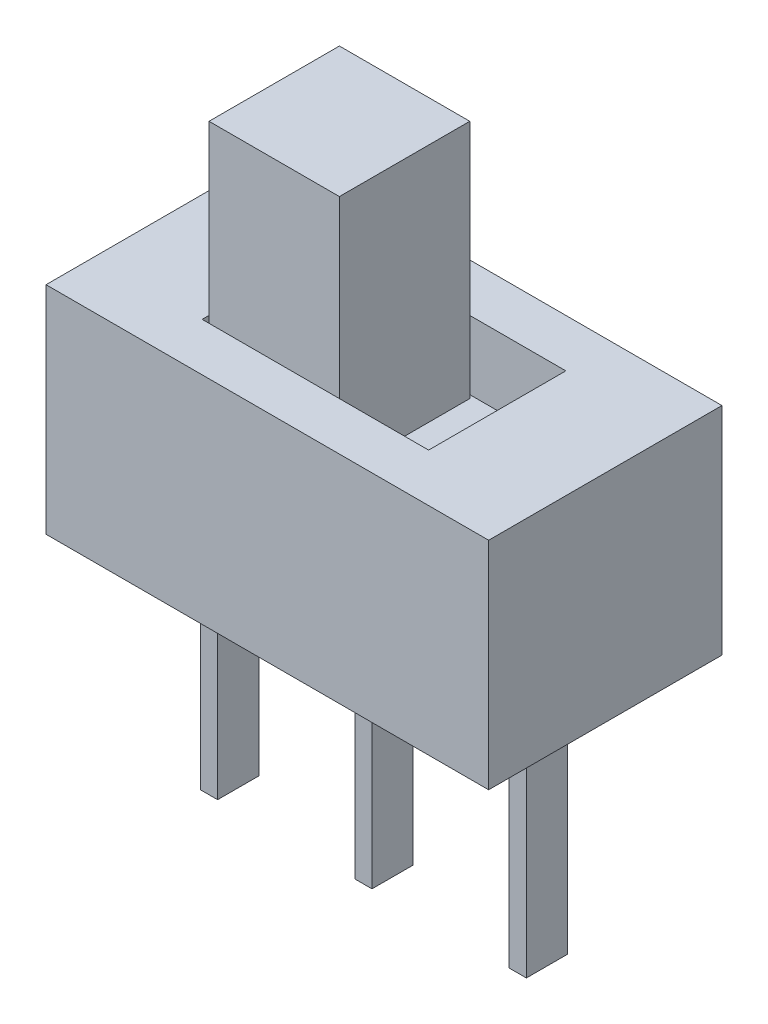
ISO-10303-21;
HEADER;
FILE_DESCRIPTION(('STEP AP214'),'2;1');
FILE_NAME('part.step','',(''),(''),'','','');
FILE_SCHEMA(('AUTOMOTIVE_DESIGN { 1 0 10303 214 1 1 1 1 }'));
ENDSEC;
DATA;
#1=APPLICATION_CONTEXT('core data for automotive mechanical design processes');
#2=APPLICATION_PROTOCOL_DEFINITION('international standard','automotive_design',2000,#1);
#3=PRODUCT_CONTEXT('',#1,'mechanical');
#4=PRODUCT('Part','Part','',(#3));
#5=PRODUCT_RELATED_PRODUCT_CATEGORY('part','',(#4));
#6=PRODUCT_DEFINITION_FORMATION('','',#4);
#7=PRODUCT_DEFINITION_CONTEXT('part definition',#1,'design');
#8=PRODUCT_DEFINITION('design','',#6,#7);
#9=PRODUCT_DEFINITION_SHAPE('','',#8);
#10=(LENGTH_UNIT() NAMED_UNIT(*) SI_UNIT(.MILLI.,.METRE.));
#11=(NAMED_UNIT(*) PLANE_ANGLE_UNIT() SI_UNIT($,.RADIAN.));
#12=(NAMED_UNIT(*) SI_UNIT($,.STERADIAN.) SOLID_ANGLE_UNIT());
#13=UNCERTAINTY_MEASURE_WITH_UNIT(LENGTH_MEASURE(1.E-05),#10,'distance_accuracy_value','');
#14=(GEOMETRIC_REPRESENTATION_CONTEXT(3) GLOBAL_UNCERTAINTY_ASSIGNED_CONTEXT((#13)) GLOBAL_UNIT_ASSIGNED_CONTEXT((#10,
#11,#12)) REPRESENTATION_CONTEXT('',''));
#15=CARTESIAN_POINT('',(0.,0.,0.));
#16=DIRECTION('',(0.,0.,1.));
#17=DIRECTION('',(1.,0.,0.));
#18=AXIS2_PLACEMENT_3D('',#15,#16,#17);
#19=CARTESIAN_POINT('',(0.,0.,0.));
#20=DIRECTION('',(0.,1.,0.));
#21=DIRECTION('',(0.,0.,1.));
#22=AXIS2_PLACEMENT_3D('',#19,#20,#21);
#23=PLANE('',#22);
#24=DIRECTION('',(0.,0.,1.));
#25=VECTOR('',#24,1.);
#26=CARTESIAN_POINT('',(-4.25,0.,0.6));
#27=LINE('',#26,#25);
#28=CARTESIAN_POINT('',(-4.25,0.,-0.6));
#29=VERTEX_POINT('',#28);
#30=CARTESIAN_POINT('',(-4.25,0.,0.6));
#31=VERTEX_POINT('',#30);
#32=EDGE_CURVE('E265',#29,#31,#27,.T.);
#33=ORIENTED_EDGE('',*,*,#32,.F.);
#34=DIRECTION('',(1.,0.,0.));
#35=VECTOR('',#34,1.);
#36=CARTESIAN_POINT('',(-4.75,0.,-0.6));
#37=LINE('',#36,#35);
#38=CARTESIAN_POINT('',(-4.75,0.,-0.6));
#39=VERTEX_POINT('',#38);
#40=EDGE_CURVE('E235',#39,#29,#37,.T.);
#41=ORIENTED_EDGE('',*,*,#40,.F.);
#42=DIRECTION('',(0.,0.,-1.));
#43=VECTOR('',#42,1.);
#44=CARTESIAN_POINT('',(-4.75,0.,0.6));
#45=LINE('',#44,#43);
#46=CARTESIAN_POINT('',(-4.75,0.,0.6));
#47=VERTEX_POINT('',#46);
#48=EDGE_CURVE('E253',#47,#39,#45,.T.);
#49=ORIENTED_EDGE('',*,*,#48,.F.);
#50=DIRECTION('',(-1.,0.,0.));
#51=VECTOR('',#50,1.);
#52=CARTESIAN_POINT('',(-4.75,0.,0.6));
#53=LINE('',#52,#51);
#54=EDGE_CURVE('E259',#31,#47,#53,.T.);
#55=ORIENTED_EDGE('',*,*,#54,.F.);
#56=EDGE_LOOP('',(#33,#41,#49,#55));
#57=FACE_BOUND('',#56,.T.);
#58=DIRECTION('',(0.,0.,-1.));
#59=VECTOR('',#58,1.);
#60=CARTESIAN_POINT('',(6.45,0.,-3.4));
#61=LINE('',#60,#59);
#62=CARTESIAN_POINT('',(6.45,0.,3.4));
#63=VERTEX_POINT('',#62);
#64=CARTESIAN_POINT('',(6.45,0.,-3.4));
#65=VERTEX_POINT('',#64);
#66=EDGE_CURVE('E358',#63,#65,#61,.T.);
#67=ORIENTED_EDGE('',*,*,#66,.F.);
#68=DIRECTION('',(1.,0.,0.));
#69=VECTOR('',#68,1.);
#70=CARTESIAN_POINT('',(-6.45,0.,3.4));
#71=LINE('',#70,#69);
#72=CARTESIAN_POINT('',(-6.45,0.,3.4));
#73=VERTEX_POINT('',#72);
#74=EDGE_CURVE('E369',#73,#63,#71,.T.);
#75=ORIENTED_EDGE('',*,*,#74,.F.);
#76=DIRECTION('',(0.,0.,1.));
#77=VECTOR('',#76,1.);
#78=CARTESIAN_POINT('',(-6.45,0.,-3.4));
#79=LINE('',#78,#77);
#80=CARTESIAN_POINT('',(-6.45,0.,-3.4));
#81=VERTEX_POINT('',#80);
#82=EDGE_CURVE('E380',#81,#73,#79,.T.);
#83=ORIENTED_EDGE('',*,*,#82,.F.);
#84=DIRECTION('',(-1.,0.,0.));
#85=VECTOR('',#84,1.);
#86=CARTESIAN_POINT('',(-6.45,0.,-3.4));
#87=LINE('',#86,#85);
#88=EDGE_CURVE('E378',#65,#81,#87,.T.);
#89=ORIENTED_EDGE('',*,*,#88,.F.);
#90=EDGE_LOOP('',(#67,#75,#83,#89));
#91=FACE_BOUND('',#90,.T.);
#92=DIRECTION('',(0.,0.,1.));
#93=VECTOR('',#92,1.);
#94=CARTESIAN_POINT('',(0.25,0.,0.6));
#95=LINE('',#94,#93);
#96=CARTESIAN_POINT('',(0.25,0.,-0.6));
#97=VERTEX_POINT('',#96);
#98=CARTESIAN_POINT('',(0.25,0.,0.6));
#99=VERTEX_POINT('',#98);
#100=EDGE_CURVE('E230',#97,#99,#95,.T.);
#101=ORIENTED_EDGE('',*,*,#100,.F.);
#102=DIRECTION('',(1.,0.,0.));
#103=VECTOR('',#102,1.);
#104=CARTESIAN_POINT('',(-0.25,0.,-0.6));
#105=LINE('',#104,#103);
#106=CARTESIAN_POINT('',(-0.25,0.,-0.6));
#107=VERTEX_POINT('',#106);
#108=EDGE_CURVE('E272',#107,#97,#105,.T.);
#109=ORIENTED_EDGE('',*,*,#108,.F.);
#110=DIRECTION('',(0.,0.,-1.));
#111=VECTOR('',#110,1.);
#112=CARTESIAN_POINT('',(-0.25,0.,0.6));
#113=LINE('',#112,#111);
#114=CARTESIAN_POINT('',(-0.25,0.,0.6));
#115=VERTEX_POINT('',#114);
#116=EDGE_CURVE('E284',#115,#107,#113,.T.);
#117=ORIENTED_EDGE('',*,*,#116,.F.);
#118=DIRECTION('',(-1.,0.,0.));
#119=VECTOR('',#118,1.);
#120=CARTESIAN_POINT('',(-0.25,0.,0.6));
#121=LINE('',#120,#119);
#122=EDGE_CURVE('E281',#99,#115,#121,.T.);
#123=ORIENTED_EDGE('',*,*,#122,.F.);
#124=EDGE_LOOP('',(#101,#109,#117,#123));
#125=FACE_BOUND('',#124,.T.);
#126=DIRECTION('',(0.,0.,1.));
#127=VECTOR('',#126,1.);
#128=CARTESIAN_POINT('',(4.75,0.,0.6));
#129=LINE('',#128,#127);
#130=CARTESIAN_POINT('',(4.75,0.,-0.6));
#131=VERTEX_POINT('',#130);
#132=CARTESIAN_POINT('',(4.75,0.,0.6));
#133=VERTEX_POINT('',#132);
#134=EDGE_CURVE('E228',#131,#133,#129,.T.);
#135=ORIENTED_EDGE('',*,*,#134,.F.);
#136=DIRECTION('',(1.,0.,0.));
#137=VECTOR('',#136,1.);
#138=CARTESIAN_POINT('',(4.25,0.,-0.6));
#139=LINE('',#138,#137);
#140=CARTESIAN_POINT('',(4.25,0.,-0.6));
#141=VERTEX_POINT('',#140);
#142=EDGE_CURVE('E217',#141,#131,#139,.T.);
#143=ORIENTED_EDGE('',*,*,#142,.F.);
#144=DIRECTION('',(0.,0.,-1.));
#145=VECTOR('',#144,1.);
#146=CARTESIAN_POINT('',(4.25,0.,0.6));
#147=LINE('',#146,#145);
#148=CARTESIAN_POINT('',(4.25,0.,0.6));
#149=VERTEX_POINT('',#148);
#150=EDGE_CURVE('E67',#149,#141,#147,.T.);
#151=ORIENTED_EDGE('',*,*,#150,.F.);
#152=DIRECTION('',(-1.,0.,0.));
#153=VECTOR('',#152,1.);
#154=CARTESIAN_POINT('',(4.25,0.,0.6));
#155=LINE('',#154,#153);
#156=EDGE_CURVE('E62',#133,#149,#155,.T.);
#157=ORIENTED_EDGE('',*,*,#156,.F.);
#158=EDGE_LOOP('',(#135,#143,#151,#157));
#159=FACE_BOUND('',#158,.T.);
#160=ADVANCED_FACE('F47',(#57,#91,#125,#159),#23,.F.);
#161=CARTESIAN_POINT('',(0.,4.3,0.));
#162=DIRECTION('',(0.,1.,0.));
#163=DIRECTION('',(0.,0.,1.));
#164=AXIS2_PLACEMENT_3D('',#161,#162,#163);
#165=PLANE('',#164);
#166=DIRECTION('',(0.,0.,-1.));
#167=VECTOR('',#166,1.);
#168=CARTESIAN_POINT('',(3.3,4.3,-2.));
#169=LINE('',#168,#167);
#170=CARTESIAN_POINT('',(3.3,4.3,2.));
#171=VERTEX_POINT('',#170);
#172=CARTESIAN_POINT('',(3.3,4.3,-2.));
#173=VERTEX_POINT('',#172);
#174=EDGE_CURVE('E333',#171,#173,#169,.T.);
#175=ORIENTED_EDGE('',*,*,#174,.T.);
#176=DIRECTION('',(-1.,0.,0.));
#177=VECTOR('',#176,1.);
#178=CARTESIAN_POINT('',(-3.3,4.3,-2.));
#179=LINE('',#178,#177);
#180=CARTESIAN_POINT('',(-3.3,4.3,-2.));
#181=VERTEX_POINT('',#180);
#182=EDGE_CURVE('E336',#173,#181,#179,.T.);
#183=ORIENTED_EDGE('',*,*,#182,.T.);
#184=DIRECTION('',(0.,0.,1.));
#185=VECTOR('',#184,1.);
#186=CARTESIAN_POINT('',(-3.3,4.3,-2.));
#187=LINE('',#186,#185);
#188=CARTESIAN_POINT('',(-3.3,4.3,2.));
#189=VERTEX_POINT('',#188);
#190=EDGE_CURVE('E340',#181,#189,#187,.T.);
#191=ORIENTED_EDGE('',*,*,#190,.T.);
#192=DIRECTION('',(1.,0.,0.));
#193=VECTOR('',#192,1.);
#194=CARTESIAN_POINT('',(-3.3,4.3,2.));
#195=LINE('',#194,#193);
#196=EDGE_CURVE('E343',#189,#171,#195,.T.);
#197=ORIENTED_EDGE('',*,*,#196,.T.);
#198=EDGE_LOOP('',(#175,#183,#191,#197));
#199=FACE_BOUND('',#198,.T.);
#200=DIRECTION('',(-1.,0.,0.));
#201=VECTOR('',#200,1.);
#202=CARTESIAN_POINT('',(-3.2,4.3,-1.9));
#203=LINE('',#202,#201);
#204=CARTESIAN_POINT('',(0.6,4.3,-1.9));
#205=VERTEX_POINT('',#204);
#206=CARTESIAN_POINT('',(-3.2,4.3,-1.9));
#207=VERTEX_POINT('',#206);
#208=EDGE_CURVE('E309',#205,#207,#203,.T.);
#209=ORIENTED_EDGE('',*,*,#208,.F.);
#210=DIRECTION('',(0.,0.,-1.));
#211=VECTOR('',#210,1.);
#212=CARTESIAN_POINT('',(0.6,4.3,-1.9));
#213=LINE('',#212,#211);
#214=CARTESIAN_POINT('',(0.599999999999999,4.3,1.9));
#215=VERTEX_POINT('',#214);
#216=EDGE_CURVE('E313',#215,#205,#213,.T.);
#217=ORIENTED_EDGE('',*,*,#216,.F.);
#218=DIRECTION('',(1.,0.,0.));
#219=VECTOR('',#218,1.);
#220=CARTESIAN_POINT('',(-3.2,4.3,1.9));
#221=LINE('',#220,#219);
#222=CARTESIAN_POINT('',(-3.2,4.3,1.9));
#223=VERTEX_POINT('',#222);
#224=EDGE_CURVE('E301',#223,#215,#221,.T.);
#225=ORIENTED_EDGE('',*,*,#224,.F.);
#226=DIRECTION('',(0.,0.,1.));
#227=VECTOR('',#226,1.);
#228=CARTESIAN_POINT('',(-3.2,4.3,-1.9));
#229=LINE('',#228,#227);
#230=EDGE_CURVE('E306',#207,#223,#229,.T.);
#231=ORIENTED_EDGE('',*,*,#230,.F.);
#232=EDGE_LOOP('',(#209,#217,#225,#231));
#233=FACE_BOUND('',#232,.T.);
#234=ADVANCED_FACE('F415',(#199,#233),#165,.T.);
#235=CARTESIAN_POINT('',(6.45,6.3,-3.4));
#236=DIRECTION('',(-1.,0.,0.));
#237=DIRECTION('',(0.,0.,1.));
#238=AXIS2_PLACEMENT_3D('',#235,#236,#237);
#239=PLANE('',#238);
#240=ORIENTED_EDGE('',*,*,#66,.T.);
#241=DIRECTION('',(0.,-1.,0.));
#242=VECTOR('',#241,1.);
#243=CARTESIAN_POINT('',(6.45,6.3,-3.4));
#244=LINE('',#243,#242);
#245=CARTESIAN_POINT('',(6.45,6.3,-3.4));
#246=VERTEX_POINT('',#245);
#247=EDGE_CURVE('E12',#246,#65,#244,.T.);
#248=ORIENTED_EDGE('',*,*,#247,.F.);
#249=DIRECTION('',(0.,0.,-1.));
#250=VECTOR('',#249,1.);
#251=CARTESIAN_POINT('',(6.45,6.3,-3.4));
#252=LINE('',#251,#250);
#253=CARTESIAN_POINT('',(6.45,6.3,3.4));
#254=VERTEX_POINT('',#253);
#255=EDGE_CURVE('E365',#254,#246,#252,.T.);
#256=ORIENTED_EDGE('',*,*,#255,.F.);
#257=DIRECTION('',(0.,-1.,0.));
#258=VECTOR('',#257,1.);
#259=CARTESIAN_POINT('',(6.45,6.3,3.4));
#260=LINE('',#259,#258);
#261=EDGE_CURVE('E375',#254,#63,#260,.T.);
#262=ORIENTED_EDGE('',*,*,#261,.T.);
#263=EDGE_LOOP('',(#240,#248,#256,#262));
#264=FACE_BOUND('',#263,.T.);
#265=ADVANCED_FACE('F49',(#264),#239,.F.);
#266=CARTESIAN_POINT('',(-6.45,6.3,-3.4));
#267=DIRECTION('',(0.,0.,1.));
#268=DIRECTION('',(1.,0.,0.));
#269=AXIS2_PLACEMENT_3D('',#266,#267,#268);
#270=PLANE('',#269);
#271=ORIENTED_EDGE('',*,*,#88,.T.);
#272=DIRECTION('',(0.,-1.,0.));
#273=VECTOR('',#272,1.);
#274=CARTESIAN_POINT('',(-6.45,6.3,-3.4));
#275=LINE('',#274,#273);
#276=CARTESIAN_POINT('',(-6.45,6.3,-3.4));
#277=VERTEX_POINT('',#276);
#278=EDGE_CURVE('E55',#277,#81,#275,.T.);
#279=ORIENTED_EDGE('',*,*,#278,.F.);
#280=DIRECTION('',(-1.,0.,0.));
#281=VECTOR('',#280,1.);
#282=CARTESIAN_POINT('',(-6.45,6.3,-3.4));
#283=LINE('',#282,#281);
#284=EDGE_CURVE('E368',#246,#277,#283,.T.);
#285=ORIENTED_EDGE('',*,*,#284,.F.);
#286=ORIENTED_EDGE('',*,*,#247,.T.);
#287=EDGE_LOOP('',(#271,#279,#285,#286));
#288=FACE_BOUND('',#287,.T.);
#289=ADVANCED_FACE('F408',(#288),#270,.F.);
#290=CARTESIAN_POINT('',(-6.45,6.3,-3.4));
#291=DIRECTION('',(1.,0.,0.));
#292=DIRECTION('',(0.,0.,-1.));
#293=AXIS2_PLACEMENT_3D('',#290,#291,#292);
#294=PLANE('',#293);
#295=ORIENTED_EDGE('',*,*,#82,.T.);
#296=DIRECTION('',(0.,-1.,0.));
#297=VECTOR('',#296,1.);
#298=CARTESIAN_POINT('',(-6.45,6.3,3.4));
#299=LINE('',#298,#297);
#300=CARTESIAN_POINT('',(-6.45,6.3,3.4));
#301=VERTEX_POINT('',#300);
#302=EDGE_CURVE('E385',#301,#73,#299,.T.);
#303=ORIENTED_EDGE('',*,*,#302,.F.);
#304=DIRECTION('',(0.,0.,1.));
#305=VECTOR('',#304,1.);
#306=CARTESIAN_POINT('',(-6.45,6.3,-3.4));
#307=LINE('',#306,#305);
#308=EDGE_CURVE('E371',#277,#301,#307,.T.);
#309=ORIENTED_EDGE('',*,*,#308,.F.);
#310=ORIENTED_EDGE('',*,*,#278,.T.);
#311=EDGE_LOOP('',(#295,#303,#309,#310));
#312=FACE_BOUND('',#311,.T.);
#313=ADVANCED_FACE('F392',(#312),#294,.F.);
#314=CARTESIAN_POINT('',(-6.45,6.3,3.4));
#315=DIRECTION('',(0.,0.,-1.));
#316=DIRECTION('',(-1.,0.,0.));
#317=AXIS2_PLACEMENT_3D('',#314,#315,#316);
#318=PLANE('',#317);
#319=ORIENTED_EDGE('',*,*,#74,.T.);
#320=ORIENTED_EDGE('',*,*,#261,.F.);
#321=DIRECTION('',(1.,0.,0.));
#322=VECTOR('',#321,1.);
#323=CARTESIAN_POINT('',(-6.45,6.3,3.4));
#324=LINE('',#323,#322);
#325=EDGE_CURVE('E373',#301,#254,#324,.T.);
#326=ORIENTED_EDGE('',*,*,#325,.F.);
#327=ORIENTED_EDGE('',*,*,#302,.T.);
#328=EDGE_LOOP('',(#319,#320,#326,#327));
#329=FACE_BOUND('',#328,.T.);
#330=ADVANCED_FACE('F401',(#329),#318,.F.);
#331=CARTESIAN_POINT('',(0.,6.3,0.));
#332=DIRECTION('',(0.,1.,0.));
#333=DIRECTION('',(0.,0.,1.));
#334=AXIS2_PLACEMENT_3D('',#331,#332,#333);
#335=PLANE('',#334);
#336=DIRECTION('',(0.,0.,-1.));
#337=VECTOR('',#336,1.);
#338=CARTESIAN_POINT('',(3.3,6.3,-2.));
#339=LINE('',#338,#337);
#340=CARTESIAN_POINT('',(3.3,6.3,2.));
#341=VERTEX_POINT('',#340);
#342=CARTESIAN_POINT('',(3.3,6.3,-2.));
#343=VERTEX_POINT('',#342);
#344=EDGE_CURVE('E319',#341,#343,#339,.T.);
#345=ORIENTED_EDGE('',*,*,#344,.F.);
#346=DIRECTION('',(1.,0.,0.));
#347=VECTOR('',#346,1.);
#348=CARTESIAN_POINT('',(-3.3,6.3,2.));
#349=LINE('',#348,#347);
#350=CARTESIAN_POINT('',(-3.3,6.3,2.));
#351=VERTEX_POINT('',#350);
#352=EDGE_CURVE('E337',#351,#341,#349,.T.);
#353=ORIENTED_EDGE('',*,*,#352,.F.);
#354=DIRECTION('',(0.,0.,1.));
#355=VECTOR('',#354,1.);
#356=CARTESIAN_POINT('',(-3.3,6.3,-2.));
#357=LINE('',#356,#355);
#358=CARTESIAN_POINT('',(-3.3,6.3,-2.));
#359=VERTEX_POINT('',#358);
#360=EDGE_CURVE('E351',#359,#351,#357,.T.);
#361=ORIENTED_EDGE('',*,*,#360,.F.);
#362=DIRECTION('',(-1.,0.,0.));
#363=VECTOR('',#362,1.);
#364=CARTESIAN_POINT('',(-3.3,6.3,-2.));
#365=LINE('',#364,#363);
#366=EDGE_CURVE('E348',#343,#359,#365,.T.);
#367=ORIENTED_EDGE('',*,*,#366,.F.);
#368=EDGE_LOOP('',(#345,#353,#361,#367));
#369=FACE_BOUND('',#368,.T.);
#370=ORIENTED_EDGE('',*,*,#255,.T.);
#371=ORIENTED_EDGE('',*,*,#284,.T.);
#372=ORIENTED_EDGE('',*,*,#308,.T.);
#373=ORIENTED_EDGE('',*,*,#325,.T.);
#374=EDGE_LOOP('',(#370,#371,#372,#373));
#375=FACE_BOUND('',#374,.T.);
#376=ADVANCED_FACE('F407',(#369,#375),#335,.T.);
#377=CARTESIAN_POINT('',(3.3,4.3,-2.));
#378=DIRECTION('',(1.,0.,0.));
#379=DIRECTION('',(0.,0.,-1.));
#380=AXIS2_PLACEMENT_3D('',#377,#378,#379);
#381=PLANE('',#380);
#382=ORIENTED_EDGE('',*,*,#344,.T.);
#383=DIRECTION('',(0.,1.,0.));
#384=VECTOR('',#383,1.);
#385=CARTESIAN_POINT('',(3.3,4.3,-2.));
#386=LINE('',#385,#384);
#387=EDGE_CURVE('E346',#173,#343,#386,.T.);
#388=ORIENTED_EDGE('',*,*,#387,.F.);
#389=ORIENTED_EDGE('',*,*,#174,.F.);
#390=DIRECTION('',(0.,1.,0.));
#391=VECTOR('',#390,1.);
#392=CARTESIAN_POINT('',(3.3,4.3,2.));
#393=LINE('',#392,#391);
#394=EDGE_CURVE('E356',#171,#341,#393,.T.);
#395=ORIENTED_EDGE('',*,*,#394,.T.);
#396=EDGE_LOOP('',(#382,#388,#389,#395));
#397=FACE_BOUND('',#396,.T.);
#398=ADVANCED_FACE('F431',(#397),#381,.F.);
#399=CARTESIAN_POINT('',(-3.3,4.3,2.));
#400=DIRECTION('',(0.,0.,1.));
#401=DIRECTION('',(1.,0.,0.));
#402=AXIS2_PLACEMENT_3D('',#399,#400,#401);
#403=PLANE('',#402);
#404=ORIENTED_EDGE('',*,*,#352,.T.);
#405=ORIENTED_EDGE('',*,*,#394,.F.);
#406=ORIENTED_EDGE('',*,*,#196,.F.);
#407=DIRECTION('',(0.,1.,0.));
#408=VECTOR('',#407,1.);
#409=CARTESIAN_POINT('',(-3.3,4.3,2.));
#410=LINE('',#409,#408);
#411=EDGE_CURVE('E359',#189,#351,#410,.T.);
#412=ORIENTED_EDGE('',*,*,#411,.T.);
#413=EDGE_LOOP('',(#404,#405,#406,#412));
#414=FACE_BOUND('',#413,.T.);
#415=ADVANCED_FACE('F436',(#414),#403,.F.);
#416=CARTESIAN_POINT('',(-3.3,4.3,-2.));
#417=DIRECTION('',(-1.,0.,0.));
#418=DIRECTION('',(0.,0.,1.));
#419=AXIS2_PLACEMENT_3D('',#416,#417,#418);
#420=PLANE('',#419);
#421=ORIENTED_EDGE('',*,*,#360,.T.);
#422=ORIENTED_EDGE('',*,*,#411,.F.);
#423=ORIENTED_EDGE('',*,*,#190,.F.);
#424=DIRECTION('',(0.,1.,0.));
#425=VECTOR('',#424,1.);
#426=CARTESIAN_POINT('',(-3.3,4.3,-2.));
#427=LINE('',#426,#425);
#428=EDGE_CURVE('E361',#181,#359,#427,.T.);
#429=ORIENTED_EDGE('',*,*,#428,.T.);
#430=EDGE_LOOP('',(#421,#422,#423,#429));
#431=FACE_BOUND('',#430,.T.);
#432=ADVANCED_FACE('F451',(#431),#420,.F.);
#433=CARTESIAN_POINT('',(-3.3,4.3,-2.));
#434=DIRECTION('',(0.,0.,-1.));
#435=DIRECTION('',(-1.,0.,0.));
#436=AXIS2_PLACEMENT_3D('',#433,#434,#435);
#437=PLANE('',#436);
#438=ORIENTED_EDGE('',*,*,#366,.T.);
#439=ORIENTED_EDGE('',*,*,#428,.F.);
#440=ORIENTED_EDGE('',*,*,#182,.F.);
#441=ORIENTED_EDGE('',*,*,#387,.T.);
#442=EDGE_LOOP('',(#438,#439,#440,#441));
#443=FACE_BOUND('',#442,.T.);
#444=ADVANCED_FACE('F445',(#443),#437,.F.);
#445=CARTESIAN_POINT('',(0.6,21.6740115370178,-1.9));
#446=DIRECTION('',(-1.,0.,0.));
#447=DIRECTION('',(0.,0.,1.));
#448=AXIS2_PLACEMENT_3D('',#445,#446,#447);
#449=PLANE('',#448);
#450=DIRECTION('',(0.,0.,-1.));
#451=VECTOR('',#450,1.);
#452=CARTESIAN_POINT('',(0.6,11.3,-1.9));
#453=LINE('',#452,#451);
#454=CARTESIAN_POINT('',(0.599999999999999,11.3,1.9));
#455=VERTEX_POINT('',#454);
#456=CARTESIAN_POINT('',(0.6,11.3,-1.9));
#457=VERTEX_POINT('',#456);
#458=EDGE_CURVE('E323',#455,#457,#453,.T.);
#459=ORIENTED_EDGE('',*,*,#458,.F.);
#460=DIRECTION('',(0.,-1.,0.));
#461=VECTOR('',#460,1.);
#462=CARTESIAN_POINT('',(0.599999999999999,21.6740115370178,1.9));
#463=LINE('',#462,#461);
#464=EDGE_CURVE('E300',#455,#215,#463,.T.);
#465=ORIENTED_EDGE('',*,*,#464,.T.);
#466=ORIENTED_EDGE('',*,*,#216,.T.);
#467=DIRECTION('',(0.,-1.,0.));
#468=VECTOR('',#467,1.);
#469=CARTESIAN_POINT('',(0.6,21.6740115370178,-1.9));
#470=LINE('',#469,#468);
#471=EDGE_CURVE('E312',#457,#205,#470,.T.);
#472=ORIENTED_EDGE('',*,*,#471,.F.);
#473=EDGE_LOOP('',(#459,#465,#466,#472));
#474=FACE_BOUND('',#473,.T.);
#475=ADVANCED_FACE('F458',(#474),#449,.F.);
#476=CARTESIAN_POINT('',(-3.2,21.6740115370178,-1.9));
#477=DIRECTION('',(0.,0.,1.));
#478=DIRECTION('',(1.,0.,0.));
#479=AXIS2_PLACEMENT_3D('',#476,#477,#478);
#480=PLANE('',#479);
#481=DIRECTION('',(-1.,0.,0.));
#482=VECTOR('',#481,1.);
#483=CARTESIAN_POINT('',(-3.2,11.3,-1.9));
#484=LINE('',#483,#482);
#485=CARTESIAN_POINT('',(-3.2,11.3,-1.9));
#486=VERTEX_POINT('',#485);
#487=EDGE_CURVE('E320',#457,#486,#484,.T.);
#488=ORIENTED_EDGE('',*,*,#487,.F.);
#489=ORIENTED_EDGE('',*,*,#471,.T.);
#490=ORIENTED_EDGE('',*,*,#208,.T.);
#491=DIRECTION('',(0.,-1.,0.));
#492=VECTOR('',#491,1.);
#493=CARTESIAN_POINT('',(-3.2,21.6740115370178,-1.9));
#494=LINE('',#493,#492);
#495=EDGE_CURVE('E308',#486,#207,#494,.T.);
#496=ORIENTED_EDGE('',*,*,#495,.F.);
#497=EDGE_LOOP('',(#488,#489,#490,#496));
#498=FACE_BOUND('',#497,.T.);
#499=ADVANCED_FACE('F470',(#498),#480,.F.);
#500=CARTESIAN_POINT('',(-3.2,21.6740115370178,-1.9));
#501=DIRECTION('',(1.,0.,0.));
#502=DIRECTION('',(0.,0.,-1.));
#503=AXIS2_PLACEMENT_3D('',#500,#501,#502);
#504=PLANE('',#503);
#505=DIRECTION('',(0.,0.,1.));
#506=VECTOR('',#505,1.);
#507=CARTESIAN_POINT('',(-3.2,11.3,-1.9));
#508=LINE('',#507,#506);
#509=CARTESIAN_POINT('',(-3.2,11.3,1.9));
#510=VERTEX_POINT('',#509);
#511=EDGE_CURVE('E316',#486,#510,#508,.T.);
#512=ORIENTED_EDGE('',*,*,#511,.F.);
#513=ORIENTED_EDGE('',*,*,#495,.T.);
#514=ORIENTED_EDGE('',*,*,#230,.T.);
#515=DIRECTION('',(0.,-1.,0.));
#516=VECTOR('',#515,1.);
#517=CARTESIAN_POINT('',(-3.2,21.6740115370178,1.9));
#518=LINE('',#517,#516);
#519=EDGE_CURVE('E305',#510,#223,#518,.T.);
#520=ORIENTED_EDGE('',*,*,#519,.F.);
#521=EDGE_LOOP('',(#512,#513,#514,#520));
#522=FACE_BOUND('',#521,.T.);
#523=ADVANCED_FACE('F474',(#522),#504,.F.);
#524=CARTESIAN_POINT('',(-3.2,21.6740115370178,1.9));
#525=DIRECTION('',(0.,0.,-1.));
#526=DIRECTION('',(-1.,0.,0.));
#527=AXIS2_PLACEMENT_3D('',#524,#525,#526);
#528=PLANE('',#527);
#529=DIRECTION('',(1.,0.,0.));
#530=VECTOR('',#529,1.);
#531=CARTESIAN_POINT('',(-3.2,11.3,1.9));
#532=LINE('',#531,#530);
#533=EDGE_CURVE('E304',#510,#455,#532,.T.);
#534=ORIENTED_EDGE('',*,*,#533,.F.);
#535=ORIENTED_EDGE('',*,*,#519,.T.);
#536=ORIENTED_EDGE('',*,*,#224,.T.);
#537=ORIENTED_EDGE('',*,*,#464,.F.);
#538=EDGE_LOOP('',(#534,#535,#536,#537));
#539=FACE_BOUND('',#538,.T.);
#540=ADVANCED_FACE('F466',(#539),#528,.F.);
#541=CARTESIAN_POINT('',(0.,11.3,0.));
#542=DIRECTION('',(0.,1.,0.));
#543=DIRECTION('',(0.,0.,1.));
#544=AXIS2_PLACEMENT_3D('',#541,#542,#543);
#545=PLANE('',#544);
#546=ORIENTED_EDGE('',*,*,#533,.T.);
#547=ORIENTED_EDGE('',*,*,#458,.T.);
#548=ORIENTED_EDGE('',*,*,#487,.T.);
#549=ORIENTED_EDGE('',*,*,#511,.T.);
#550=EDGE_LOOP('',(#546,#547,#548,#549));
#551=FACE_BOUND('',#550,.T.);
#552=ADVANCED_FACE('F462',(#551),#545,.T.);
#553=CARTESIAN_POINT('',(0.25,-7.,0.6));
#554=DIRECTION('',(-1.,0.,0.));
#555=DIRECTION('',(0.,0.,1.));
#556=AXIS2_PLACEMENT_3D('',#553,#554,#555);
#557=PLANE('',#556);
#558=ORIENTED_EDGE('',*,*,#100,.T.);
#559=DIRECTION('',(0.,1.,0.));
#560=VECTOR('',#559,1.);
#561=CARTESIAN_POINT('',(0.25,-7.,0.6));
#562=LINE('',#561,#560);
#563=CARTESIAN_POINT('',(0.25,-7.,0.6));
#564=VERTEX_POINT('',#563);
#565=EDGE_CURVE('E297',#564,#99,#562,.T.);
#566=ORIENTED_EDGE('',*,*,#565,.F.);
#567=DIRECTION('',(0.,0.,1.));
#568=VECTOR('',#567,1.);
#569=CARTESIAN_POINT('',(0.25,-7.,0.6));
#570=LINE('',#569,#568);
#571=CARTESIAN_POINT('',(0.25,-7.,-0.6));
#572=VERTEX_POINT('',#571);
#573=EDGE_CURVE('E268',#572,#564,#570,.T.);
#574=ORIENTED_EDGE('',*,*,#573,.F.);
#575=DIRECTION('',(0.,1.,0.));
#576=VECTOR('',#575,1.);
#577=CARTESIAN_POINT('',(0.25,-7.,-0.6));
#578=LINE('',#577,#576);
#579=EDGE_CURVE('E278',#572,#97,#578,.T.);
#580=ORIENTED_EDGE('',*,*,#579,.T.);
#581=EDGE_LOOP('',(#558,#566,#574,#580));
#582=FACE_BOUND('',#581,.T.);
#583=ADVANCED_FACE('F465',(#582),#557,.F.);
#584=CARTESIAN_POINT('',(-0.25,-7.,0.6));
#585=DIRECTION('',(0.,0.,-1.));
#586=DIRECTION('',(-1.,0.,0.));
#587=AXIS2_PLACEMENT_3D('',#584,#585,#586);
#588=PLANE('',#587);
#589=ORIENTED_EDGE('',*,*,#122,.T.);
#590=DIRECTION('',(0.,1.,0.));
#591=VECTOR('',#590,1.);
#592=CARTESIAN_POINT('',(-0.25,-7.,0.6));
#593=LINE('',#592,#591);
#594=CARTESIAN_POINT('',(-0.25,-7.,0.6));
#595=VERTEX_POINT('',#594);
#596=EDGE_CURVE('E294',#595,#115,#593,.T.);
#597=ORIENTED_EDGE('',*,*,#596,.F.);
#598=DIRECTION('',(-1.,0.,0.));
#599=VECTOR('',#598,1.);
#600=CARTESIAN_POINT('',(-0.25,-7.,0.6));
#601=LINE('',#600,#599);
#602=EDGE_CURVE('E271',#564,#595,#601,.T.);
#603=ORIENTED_EDGE('',*,*,#602,.F.);
#604=ORIENTED_EDGE('',*,*,#565,.T.);
#605=EDGE_LOOP('',(#589,#597,#603,#604));
#606=FACE_BOUND('',#605,.T.);
#607=ADVANCED_FACE('F484',(#606),#588,.F.);
#608=CARTESIAN_POINT('',(-0.25,-7.,0.6));
#609=DIRECTION('',(1.,0.,0.));
#610=DIRECTION('',(0.,0.,-1.));
#611=AXIS2_PLACEMENT_3D('',#608,#609,#610);
#612=PLANE('',#611);
#613=ORIENTED_EDGE('',*,*,#116,.T.);
#614=DIRECTION('',(0.,1.,0.));
#615=VECTOR('',#614,1.);
#616=CARTESIAN_POINT('',(-0.25,-7.,-0.6));
#617=LINE('',#616,#615);
#618=CARTESIAN_POINT('',(-0.25,-7.,-0.6));
#619=VERTEX_POINT('',#618);
#620=EDGE_CURVE('E291',#619,#107,#617,.T.);
#621=ORIENTED_EDGE('',*,*,#620,.F.);
#622=DIRECTION('',(0.,0.,-1.));
#623=VECTOR('',#622,1.);
#624=CARTESIAN_POINT('',(-0.25,-7.,0.6));
#625=LINE('',#624,#623);
#626=EDGE_CURVE('E274',#595,#619,#625,.T.);
#627=ORIENTED_EDGE('',*,*,#626,.F.);
#628=ORIENTED_EDGE('',*,*,#596,.T.);
#629=EDGE_LOOP('',(#613,#621,#627,#628));
#630=FACE_BOUND('',#629,.T.);
#631=ADVANCED_FACE('F488',(#630),#612,.F.);
#632=CARTESIAN_POINT('',(-0.25,-7.,-0.6));
#633=DIRECTION('',(0.,0.,1.));
#634=DIRECTION('',(1.,0.,0.));
#635=AXIS2_PLACEMENT_3D('',#632,#633,#634);
#636=PLANE('',#635);
#637=ORIENTED_EDGE('',*,*,#108,.T.);
#638=ORIENTED_EDGE('',*,*,#579,.F.);
#639=DIRECTION('',(1.,0.,0.));
#640=VECTOR('',#639,1.);
#641=CARTESIAN_POINT('',(-0.25,-7.,-0.6));
#642=LINE('',#641,#640);
#643=EDGE_CURVE('E276',#619,#572,#642,.T.);
#644=ORIENTED_EDGE('',*,*,#643,.F.);
#645=ORIENTED_EDGE('',*,*,#620,.T.);
#646=EDGE_LOOP('',(#637,#638,#644,#645));
#647=FACE_BOUND('',#646,.T.);
#648=ADVANCED_FACE('F492',(#647),#636,.F.);
#649=CARTESIAN_POINT('',(0.,-7.,0.));
#650=DIRECTION('',(0.,-1.,0.));
#651=DIRECTION('',(0.,0.,-1.));
#652=AXIS2_PLACEMENT_3D('',#649,#650,#651);
#653=PLANE('',#652);
#654=ORIENTED_EDGE('',*,*,#573,.T.);
#655=ORIENTED_EDGE('',*,*,#602,.T.);
#656=ORIENTED_EDGE('',*,*,#626,.T.);
#657=ORIENTED_EDGE('',*,*,#643,.T.);
#658=EDGE_LOOP('',(#654,#655,#656,#657));
#659=FACE_BOUND('',#658,.T.);
#660=ADVANCED_FACE('F496',(#659),#653,.T.);
#661=CARTESIAN_POINT('',(-4.25,-7.,0.6));
#662=DIRECTION('',(-1.,0.,0.));
#663=DIRECTION('',(0.,0.,1.));
#664=AXIS2_PLACEMENT_3D('',#661,#662,#663);
#665=PLANE('',#664);
#666=ORIENTED_EDGE('',*,*,#32,.T.);
#667=DIRECTION('',(0.,1.,0.));
#668=VECTOR('',#667,1.);
#669=CARTESIAN_POINT('',(-4.25,-7.,0.6));
#670=LINE('',#669,#668);
#671=CARTESIAN_POINT('',(-4.25,-7.,0.6));
#672=VERTEX_POINT('',#671);
#673=EDGE_CURVE('E262',#672,#31,#670,.T.);
#674=ORIENTED_EDGE('',*,*,#673,.F.);
#675=DIRECTION('',(0.,0.,1.));
#676=VECTOR('',#675,1.);
#677=CARTESIAN_POINT('',(-4.25,-7.,0.6));
#678=LINE('',#677,#676);
#679=CARTESIAN_POINT('',(-4.25,-7.,-0.6));
#680=VERTEX_POINT('',#679);
#681=EDGE_CURVE('E238',#680,#672,#678,.T.);
#682=ORIENTED_EDGE('',*,*,#681,.F.);
#683=DIRECTION('',(0.,1.,0.));
#684=VECTOR('',#683,1.);
#685=CARTESIAN_POINT('',(-4.25,-7.,-0.6));
#686=LINE('',#685,#684);
#687=EDGE_CURVE('E247',#680,#29,#686,.T.);
#688=ORIENTED_EDGE('',*,*,#687,.T.);
#689=EDGE_LOOP('',(#666,#674,#682,#688));
#690=FACE_BOUND('',#689,.T.);
#691=ADVANCED_FACE('F500',(#690),#665,.F.);
#692=CARTESIAN_POINT('',(-4.75,-7.,0.6));
#693=DIRECTION('',(0.,0.,-1.));
#694=DIRECTION('',(-1.,0.,0.));
#695=AXIS2_PLACEMENT_3D('',#692,#693,#694);
#696=PLANE('',#695);
#697=ORIENTED_EDGE('',*,*,#54,.T.);
#698=DIRECTION('',(0.,1.,0.));
#699=VECTOR('',#698,1.);
#700=CARTESIAN_POINT('',(-4.75,-7.,0.6));
#701=LINE('',#700,#699);
#702=CARTESIAN_POINT('',(-4.75,-7.,0.6));
#703=VERTEX_POINT('',#702);
#704=EDGE_CURVE('E256',#703,#47,#701,.T.);
#705=ORIENTED_EDGE('',*,*,#704,.F.);
#706=DIRECTION('',(-1.,0.,0.));
#707=VECTOR('',#706,1.);
#708=CARTESIAN_POINT('',(-4.75,-7.,0.6));
#709=LINE('',#708,#707);
#710=EDGE_CURVE('E240',#672,#703,#709,.T.);
#711=ORIENTED_EDGE('',*,*,#710,.F.);
#712=ORIENTED_EDGE('',*,*,#673,.T.);
#713=EDGE_LOOP('',(#697,#705,#711,#712));
#714=FACE_BOUND('',#713,.T.);
#715=ADVANCED_FACE('F504',(#714),#696,.F.);
#716=CARTESIAN_POINT('',(-4.75,-7.,0.6));
#717=DIRECTION('',(1.,0.,0.));
#718=DIRECTION('',(0.,0.,-1.));
#719=AXIS2_PLACEMENT_3D('',#716,#717,#718);
#720=PLANE('',#719);
#721=ORIENTED_EDGE('',*,*,#48,.T.);
#722=DIRECTION('',(0.,1.,0.));
#723=VECTOR('',#722,1.);
#724=CARTESIAN_POINT('',(-4.75,-7.,-0.6));
#725=LINE('',#724,#723);
#726=CARTESIAN_POINT('',(-4.75,-7.,-0.6));
#727=VERTEX_POINT('',#726);
#728=EDGE_CURVE('E250',#727,#39,#725,.T.);
#729=ORIENTED_EDGE('',*,*,#728,.F.);
#730=DIRECTION('',(0.,0.,-1.));
#731=VECTOR('',#730,1.);
#732=CARTESIAN_POINT('',(-4.75,-7.,0.6));
#733=LINE('',#732,#731);
#734=EDGE_CURVE('E242',#703,#727,#733,.T.);
#735=ORIENTED_EDGE('',*,*,#734,.F.);
#736=ORIENTED_EDGE('',*,*,#704,.T.);
#737=EDGE_LOOP('',(#721,#729,#735,#736));
#738=FACE_BOUND('',#737,.T.);
#739=ADVANCED_FACE('F508',(#738),#720,.F.);
#740=CARTESIAN_POINT('',(-4.75,-7.,-0.6));
#741=DIRECTION('',(0.,0.,1.));
#742=DIRECTION('',(1.,0.,0.));
#743=AXIS2_PLACEMENT_3D('',#740,#741,#742);
#744=PLANE('',#743);
#745=ORIENTED_EDGE('',*,*,#40,.T.);
#746=ORIENTED_EDGE('',*,*,#687,.F.);
#747=DIRECTION('',(1.,0.,0.));
#748=VECTOR('',#747,1.);
#749=CARTESIAN_POINT('',(-4.75,-7.,-0.6));
#750=LINE('',#749,#748);
#751=EDGE_CURVE('E244',#727,#680,#750,.T.);
#752=ORIENTED_EDGE('',*,*,#751,.F.);
#753=ORIENTED_EDGE('',*,*,#728,.T.);
#754=EDGE_LOOP('',(#745,#746,#752,#753));
#755=FACE_BOUND('',#754,.T.);
#756=ADVANCED_FACE('F512',(#755),#744,.F.);
#757=CARTESIAN_POINT('',(-4.5,-7.,0.));
#758=DIRECTION('',(0.,-1.,0.));
#759=DIRECTION('',(0.,0.,-1.));
#760=AXIS2_PLACEMENT_3D('',#757,#758,#759);
#761=PLANE('',#760);
#762=ORIENTED_EDGE('',*,*,#681,.T.);
#763=ORIENTED_EDGE('',*,*,#710,.T.);
#764=ORIENTED_EDGE('',*,*,#734,.T.);
#765=ORIENTED_EDGE('',*,*,#751,.T.);
#766=EDGE_LOOP('',(#762,#763,#764,#765));
#767=FACE_BOUND('',#766,.T.);
#768=ADVANCED_FACE('F516',(#767),#761,.T.);
#769=CARTESIAN_POINT('',(4.75,-7.,0.6));
#770=DIRECTION('',(-1.,0.,0.));
#771=DIRECTION('',(0.,0.,1.));
#772=AXIS2_PLACEMENT_3D('',#769,#770,#771);
#773=PLANE('',#772);
#774=ORIENTED_EDGE('',*,*,#134,.T.);
#775=DIRECTION('',(0.,1.,0.));
#776=VECTOR('',#775,1.);
#777=CARTESIAN_POINT('',(4.75,-7.,0.6));
#778=LINE('',#777,#776);
#779=CARTESIAN_POINT('',(4.75,-7.,0.6));
#780=VERTEX_POINT('',#779);
#781=EDGE_CURVE('E222',#780,#133,#778,.T.);
#782=ORIENTED_EDGE('',*,*,#781,.F.);
#783=DIRECTION('',(0.,0.,1.));
#784=VECTOR('',#783,1.);
#785=CARTESIAN_POINT('',(4.75,-7.,0.6));
#786=LINE('',#785,#784);
#787=CARTESIAN_POINT('',(4.75,-7.,-0.6));
#788=VERTEX_POINT('',#787);
#789=EDGE_CURVE('E206',#788,#780,#786,.T.);
#790=ORIENTED_EDGE('',*,*,#789,.F.);
#791=DIRECTION('',(0.,1.,0.));
#792=VECTOR('',#791,1.);
#793=CARTESIAN_POINT('',(4.75,-7.,-0.6));
#794=LINE('',#793,#792);
#795=EDGE_CURVE('E856',#788,#131,#794,.T.);
#796=ORIENTED_EDGE('',*,*,#795,.T.);
#797=EDGE_LOOP('',(#774,#782,#790,#796));
#798=FACE_BOUND('',#797,.T.);
#799=ADVANCED_FACE('F227',(#798),#773,.F.);
#800=CARTESIAN_POINT('',(4.25,-7.,0.6));
#801=DIRECTION('',(0.,0.,-1.));
#802=DIRECTION('',(-1.,0.,0.));
#803=AXIS2_PLACEMENT_3D('',#800,#801,#802);
#804=PLANE('',#803);
#805=ORIENTED_EDGE('',*,*,#156,.T.);
#806=DIRECTION('',(0.,1.,0.));
#807=VECTOR('',#806,1.);
#808=CARTESIAN_POINT('',(4.25,-7.,0.6));
#809=LINE('',#808,#807);
#810=CARTESIAN_POINT('',(4.25,-7.,0.6));
#811=VERTEX_POINT('',#810);
#812=EDGE_CURVE('E224',#811,#149,#809,.T.);
#813=ORIENTED_EDGE('',*,*,#812,.F.);
#814=DIRECTION('',(-1.,0.,0.));
#815=VECTOR('',#814,1.);
#816=CARTESIAN_POINT('',(4.25,-7.,0.6));
#817=LINE('',#816,#815);
#818=EDGE_CURVE('E209',#780,#811,#817,.T.);
#819=ORIENTED_EDGE('',*,*,#818,.F.);
#820=ORIENTED_EDGE('',*,*,#781,.T.);
#821=EDGE_LOOP('',(#805,#813,#819,#820));
#822=FACE_BOUND('',#821,.T.);
#823=ADVANCED_FACE('F221',(#822),#804,.F.);
#824=CARTESIAN_POINT('',(4.25,-7.,0.6));
#825=DIRECTION('',(1.,0.,0.));
#826=DIRECTION('',(0.,0.,-1.));
#827=AXIS2_PLACEMENT_3D('',#824,#825,#826);
#828=PLANE('',#827);
#829=ORIENTED_EDGE('',*,*,#150,.T.);
#830=DIRECTION('',(0.,1.,0.));
#831=VECTOR('',#830,1.);
#832=CARTESIAN_POINT('',(4.25,-7.,-0.6));
#833=LINE('',#832,#831);
#834=CARTESIAN_POINT('',(4.25,-7.,-0.6));
#835=VERTEX_POINT('',#834);
#836=EDGE_CURVE('E858',#835,#141,#833,.T.);
#837=ORIENTED_EDGE('',*,*,#836,.F.);
#838=DIRECTION('',(0.,0.,-1.));
#839=VECTOR('',#838,1.);
#840=CARTESIAN_POINT('',(4.25,-7.,0.6));
#841=LINE('',#840,#839);
#842=EDGE_CURVE('E225',#811,#835,#841,.T.);
#843=ORIENTED_EDGE('',*,*,#842,.F.);
#844=ORIENTED_EDGE('',*,*,#812,.T.);
#845=EDGE_LOOP('',(#829,#837,#843,#844));
#846=FACE_BOUND('',#845,.T.);
#847=ADVANCED_FACE('F525',(#846),#828,.F.);
#848=CARTESIAN_POINT('',(4.25,-7.,-0.6));
#849=DIRECTION('',(0.,0.,1.));
#850=DIRECTION('',(1.,0.,0.));
#851=AXIS2_PLACEMENT_3D('',#848,#849,#850);
#852=PLANE('',#851);
#853=ORIENTED_EDGE('',*,*,#142,.T.);
#854=ORIENTED_EDGE('',*,*,#795,.F.);
#855=DIRECTION('',(1.,0.,0.));
#856=VECTOR('',#855,1.);
#857=CARTESIAN_POINT('',(4.25,-7.,-0.6));
#858=LINE('',#857,#856);
#859=EDGE_CURVE('E212',#835,#788,#858,.T.);
#860=ORIENTED_EDGE('',*,*,#859,.F.);
#861=ORIENTED_EDGE('',*,*,#836,.T.);
#862=EDGE_LOOP('',(#853,#854,#860,#861));
#863=FACE_BOUND('',#862,.T.);
#864=ADVANCED_FACE('F528',(#863),#852,.F.);
#865=CARTESIAN_POINT('',(4.5,-7.,0.));
#866=DIRECTION('',(0.,-1.,0.));
#867=DIRECTION('',(0.,0.,-1.));
#868=AXIS2_PLACEMENT_3D('',#865,#866,#867);
#869=PLANE('',#868);
#870=ORIENTED_EDGE('',*,*,#789,.T.);
#871=ORIENTED_EDGE('',*,*,#818,.T.);
#872=ORIENTED_EDGE('',*,*,#842,.T.);
#873=ORIENTED_EDGE('',*,*,#859,.T.);
#874=EDGE_LOOP('',(#870,#871,#872,#873));
#875=FACE_BOUND('',#874,.T.);
#876=ADVANCED_FACE('F208',(#875),#869,.T.);
#877=CLOSED_SHELL('',(#160,#234,#265,#289,#313,#330,#376,#398,#415,#432,#444,#475,#499,#523,
#540,#552,#583,#607,#631,#648,#660,#691,#715,#739,#756,#768,#799,#823,#847,#864,#876));
#878=MANIFOLD_SOLID_BREP('B2',#877);
#879=ADVANCED_BREP_SHAPE_REPRESENTATION('',(#18,#878),#14);
#880=SHAPE_DEFINITION_REPRESENTATION(#9,#879);
ENDSEC;
END-ISO-10303-21;
